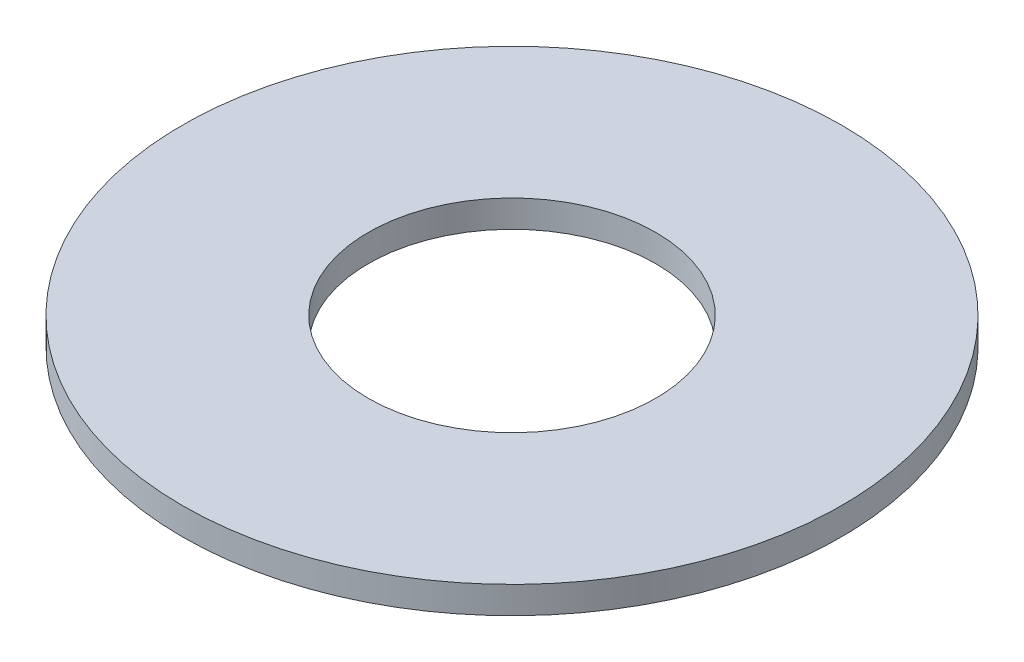
ISO-10303-21;
HEADER;
FILE_DESCRIPTION(('STEP AP214'),'2;1');
FILE_NAME('part.step','',(''),(''),'','','');
FILE_SCHEMA(('AUTOMOTIVE_DESIGN { 1 0 10303 214 1 1 1 1 }'));
ENDSEC;
DATA;
#1=APPLICATION_CONTEXT('core data for automotive mechanical design processes');
#2=APPLICATION_PROTOCOL_DEFINITION('international standard','automotive_design',2000,#1);
#3=PRODUCT_CONTEXT('',#1,'mechanical');
#4=PRODUCT('Part','Part','',(#3));
#5=PRODUCT_RELATED_PRODUCT_CATEGORY('part','',(#4));
#6=PRODUCT_DEFINITION_FORMATION('','',#4);
#7=PRODUCT_DEFINITION_CONTEXT('part definition',#1,'design');
#8=PRODUCT_DEFINITION('design','',#6,#7);
#9=PRODUCT_DEFINITION_SHAPE('','',#8);
#10=(LENGTH_UNIT() NAMED_UNIT(*) SI_UNIT(.MILLI.,.METRE.));
#11=(NAMED_UNIT(*) PLANE_ANGLE_UNIT() SI_UNIT($,.RADIAN.));
#12=(NAMED_UNIT(*) SI_UNIT($,.STERADIAN.) SOLID_ANGLE_UNIT());
#13=UNCERTAINTY_MEASURE_WITH_UNIT(LENGTH_MEASURE(1.E-05),#10,'distance_accuracy_value','');
#14=(GEOMETRIC_REPRESENTATION_CONTEXT(3) GLOBAL_UNCERTAINTY_ASSIGNED_CONTEXT((#13)) GLOBAL_UNIT_ASSIGNED_CONTEXT((#10,
#11,#12)) REPRESENTATION_CONTEXT('',''));
#15=CARTESIAN_POINT('',(0.,0.,0.));
#16=DIRECTION('',(0.,0.,1.));
#17=DIRECTION('',(1.,0.,0.));
#18=AXIS2_PLACEMENT_3D('',#15,#16,#17);
#19=CARTESIAN_POINT('',(0.,3.,0.));
#20=DIRECTION('',(0.,1.,0.));
#21=DIRECTION('',(0.,0.,1.));
#22=AXIS2_PLACEMENT_3D('',#19,#20,#21);
#23=PLANE('',#22);
#24=CARTESIAN_POINT('',(0.,3.,0.));
#25=DIRECTION('',(0.,1.,0.));
#26=DIRECTION('',(0.,0.,1.));
#27=AXIS2_PLACEMENT_3D('',#24,#25,#26);
#28=CIRCLE('',#27,36.45);
#29=CARTESIAN_POINT('',(0.,3.,36.45));
#30=VERTEX_POINT('',#29);
#31=EDGE_CURVE('E10',#30,#30,#28,.T.);
#32=ORIENTED_EDGE('',*,*,#31,.T.);
#33=EDGE_LOOP('',(#32));
#34=FACE_BOUND('',#33,.T.);
#35=CARTESIAN_POINT('',(0.,3.,0.));
#36=DIRECTION('',(0.,1.,0.));
#37=DIRECTION('',(0.,0.,1.));
#38=AXIS2_PLACEMENT_3D('',#35,#36,#37);
#39=CIRCLE('',#38,15.9);
#40=CARTESIAN_POINT('',(0.,3.,15.9));
#41=VERTEX_POINT('',#40);
#42=EDGE_CURVE('E44',#41,#41,#39,.T.);
#43=ORIENTED_EDGE('',*,*,#42,.F.);
#44=EDGE_LOOP('',(#43));
#45=FACE_BOUND('',#44,.T.);
#46=ADVANCED_FACE('F33',(#34,#45),#23,.T.);
#47=CARTESIAN_POINT('',(0.,0.,0.));
#48=DIRECTION('',(0.,1.,0.));
#49=DIRECTION('',(0.,0.,1.));
#50=AXIS2_PLACEMENT_3D('',#47,#48,#49);
#51=PLANE('',#50);
#52=CARTESIAN_POINT('',(0.,0.,0.));
#53=DIRECTION('',(0.,1.,0.));
#54=DIRECTION('',(0.,0.,1.));
#55=AXIS2_PLACEMENT_3D('',#52,#53,#54);
#56=CIRCLE('',#55,36.45);
#57=CARTESIAN_POINT('',(0.,0.,36.45));
#58=VERTEX_POINT('',#57);
#59=EDGE_CURVE('E37',#58,#58,#56,.T.);
#60=ORIENTED_EDGE('',*,*,#59,.F.);
#61=EDGE_LOOP('',(#60));
#62=FACE_BOUND('',#61,.T.);
#63=CARTESIAN_POINT('',(0.,0.,0.));
#64=DIRECTION('',(0.,1.,0.));
#65=DIRECTION('',(0.,0.,1.));
#66=AXIS2_PLACEMENT_3D('',#63,#64,#65);
#67=CIRCLE('',#66,15.9);
#68=CARTESIAN_POINT('',(0.,0.,15.9));
#69=VERTEX_POINT('',#68);
#70=EDGE_CURVE('E46',#69,#69,#67,.T.);
#71=ORIENTED_EDGE('',*,*,#70,.T.);
#72=EDGE_LOOP('',(#71));
#73=FACE_BOUND('',#72,.T.);
#74=ADVANCED_FACE('F56',(#62,#73),#51,.F.);
#75=CARTESIAN_POINT('',(0.,3.,0.));
#76=DIRECTION('',(0.,-1.,0.));
#77=DIRECTION('',(0.,0.,-1.));
#78=AXIS2_PLACEMENT_3D('',#75,#76,#77);
#79=CYLINDRICAL_SURFACE('',#78,36.45);
#80=ORIENTED_EDGE('',*,*,#31,.F.);
#81=EDGE_LOOP('',(#80));
#82=FACE_BOUND('',#81,.T.);
#83=ORIENTED_EDGE('',*,*,#59,.T.);
#84=EDGE_LOOP('',(#83));
#85=FACE_BOUND('',#84,.T.);
#86=ADVANCED_FACE('F35',(#82,#85),#79,.T.);
#87=CARTESIAN_POINT('',(0.,3.,0.));
#88=DIRECTION('',(0.,-1.,0.));
#89=DIRECTION('',(0.,0.,-1.));
#90=AXIS2_PLACEMENT_3D('',#87,#88,#89);
#91=CYLINDRICAL_SURFACE('',#90,15.9);
#92=ORIENTED_EDGE('',*,*,#42,.T.);
#93=EDGE_LOOP('',(#92));
#94=FACE_BOUND('',#93,.T.);
#95=ORIENTED_EDGE('',*,*,#70,.F.);
#96=EDGE_LOOP('',(#95));
#97=FACE_BOUND('',#96,.T.);
#98=ADVANCED_FACE('F52',(#94,#97),#91,.F.);
#99=CLOSED_SHELL('',(#46,#74,#86,#98));
#100=MANIFOLD_SOLID_BREP('B2',#99);
#101=ADVANCED_BREP_SHAPE_REPRESENTATION('',(#18,#100),#14);
#102=SHAPE_DEFINITION_REPRESENTATION(#9,#101);
ENDSEC;
END-ISO-10303-21;
